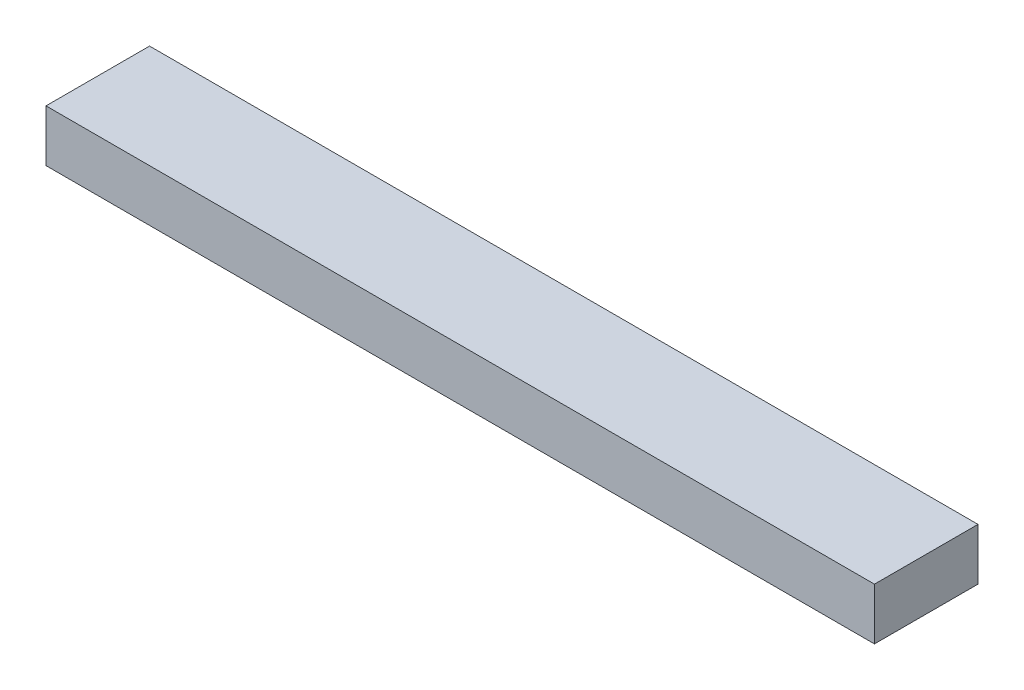
ISO-10303-21;
HEADER;
FILE_DESCRIPTION(('STEP AP214'),'2;1');
FILE_NAME('part.step','',(''),(''),'','','');
FILE_SCHEMA(('AUTOMOTIVE_DESIGN { 1 0 10303 214 1 1 1 1 }'));
ENDSEC;
DATA;
#1=APPLICATION_CONTEXT('core data for automotive mechanical design processes');
#2=APPLICATION_PROTOCOL_DEFINITION('international standard','automotive_design',2000,#1);
#3=PRODUCT_CONTEXT('',#1,'mechanical');
#4=PRODUCT('Part','Part','',(#3));
#5=PRODUCT_RELATED_PRODUCT_CATEGORY('part','',(#4));
#6=PRODUCT_DEFINITION_FORMATION('','',#4);
#7=PRODUCT_DEFINITION_CONTEXT('part definition',#1,'design');
#8=PRODUCT_DEFINITION('design','',#6,#7);
#9=PRODUCT_DEFINITION_SHAPE('','',#8);
#10=(LENGTH_UNIT() NAMED_UNIT(*) SI_UNIT(.MILLI.,.METRE.));
#11=(NAMED_UNIT(*) PLANE_ANGLE_UNIT() SI_UNIT($,.RADIAN.));
#12=(NAMED_UNIT(*) SI_UNIT($,.STERADIAN.) SOLID_ANGLE_UNIT());
#13=UNCERTAINTY_MEASURE_WITH_UNIT(LENGTH_MEASURE(1.E-05),#10,'distance_accuracy_value','');
#14=(GEOMETRIC_REPRESENTATION_CONTEXT(3) GLOBAL_UNCERTAINTY_ASSIGNED_CONTEXT((#13)) GLOBAL_UNIT_ASSIGNED_CONTEXT((#10,
#11,#12)) REPRESENTATION_CONTEXT('',''));
#15=CARTESIAN_POINT('',(0.,0.,0.));
#16=DIRECTION('',(0.,0.,1.));
#17=DIRECTION('',(1.,0.,0.));
#18=AXIS2_PLACEMENT_3D('',#15,#16,#17);
#19=CARTESIAN_POINT('',(-370.526315789474,50.,131.157894736842));
#20=DIRECTION('',(1.,0.,0.));
#21=DIRECTION('',(0.,0.,-1.));
#22=AXIS2_PLACEMENT_3D('',#19,#20,#21);
#23=PLANE('',#22);
#24=DIRECTION('',(0.,0.,1.));
#25=VECTOR('',#24,1.);
#26=CARTESIAN_POINT('',(-370.526315789474,0.,131.157894736842));
#27=LINE('',#26,#25);
#28=CARTESIAN_POINT('',(-370.526315789474,0.,31.1578947368422));
#29=VERTEX_POINT('',#28);
#30=CARTESIAN_POINT('',(-370.526315789474,0.,131.157894736842));
#31=VERTEX_POINT('',#30);
#32=EDGE_CURVE('E99',#29,#31,#27,.T.);
#33=ORIENTED_EDGE('',*,*,#32,.T.);
#34=DIRECTION('',(0.,-1.,0.));
#35=VECTOR('',#34,1.);
#36=CARTESIAN_POINT('',(-370.526315789474,50.,131.157894736842));
#37=LINE('',#36,#35);
#38=CARTESIAN_POINT('',(-370.526315789474,50.,131.157894736842));
#39=VERTEX_POINT('',#38);
#40=EDGE_CURVE('E11',#39,#31,#37,.T.);
#41=ORIENTED_EDGE('',*,*,#40,.F.);
#42=DIRECTION('',(0.,0.,1.));
#43=VECTOR('',#42,1.);
#44=CARTESIAN_POINT('',(-370.526315789474,50.,131.157894736842));
#45=LINE('',#44,#43);
#46=CARTESIAN_POINT('',(-370.526315789474,50.,31.1578947368422));
#47=VERTEX_POINT('',#46);
#48=EDGE_CURVE('E87',#47,#39,#45,.T.);
#49=ORIENTED_EDGE('',*,*,#48,.F.);
#50=DIRECTION('',(0.,-1.,0.));
#51=VECTOR('',#50,1.);
#52=CARTESIAN_POINT('',(-370.526315789474,50.,31.1578947368422));
#53=LINE('',#52,#51);
#54=EDGE_CURVE('E95',#47,#29,#53,.T.);
#55=ORIENTED_EDGE('',*,*,#54,.T.);
#56=EDGE_LOOP('',(#33,#41,#49,#55));
#57=FACE_BOUND('',#56,.T.);
#58=ADVANCED_FACE('F36',(#57),#23,.F.);
#59=CARTESIAN_POINT('',(-370.526315789474,50.,131.157894736842));
#60=DIRECTION('',(0.,0.,-1.));
#61=DIRECTION('',(-1.,0.,0.));
#62=AXIS2_PLACEMENT_3D('',#59,#60,#61);
#63=PLANE('',#62);
#64=DIRECTION('',(1.,0.,0.));
#65=VECTOR('',#64,1.);
#66=CARTESIAN_POINT('',(-370.526315789474,0.,131.157894736842));
#67=LINE('',#66,#65);
#68=CARTESIAN_POINT('',(429.473684210526,0.,131.157894736842));
#69=VERTEX_POINT('',#68);
#70=EDGE_CURVE('E91',#31,#69,#67,.T.);
#71=ORIENTED_EDGE('',*,*,#70,.T.);
#72=DIRECTION('',(0.,-1.,0.));
#73=VECTOR('',#72,1.);
#74=CARTESIAN_POINT('',(429.473684210526,50.,131.157894736842));
#75=LINE('',#74,#73);
#76=CARTESIAN_POINT('',(429.473684210526,50.,131.157894736842));
#77=VERTEX_POINT('',#76);
#78=EDGE_CURVE('E44',#77,#69,#75,.T.);
#79=ORIENTED_EDGE('',*,*,#78,.F.);
#80=DIRECTION('',(1.,0.,0.));
#81=VECTOR('',#80,1.);
#82=CARTESIAN_POINT('',(-370.526315789474,50.,131.157894736842));
#83=LINE('',#82,#81);
#84=EDGE_CURVE('E82',#39,#77,#83,.T.);
#85=ORIENTED_EDGE('',*,*,#84,.F.);
#86=ORIENTED_EDGE('',*,*,#40,.T.);
#87=EDGE_LOOP('',(#71,#79,#85,#86));
#88=FACE_BOUND('',#87,.T.);
#89=ADVANCED_FACE('F90',(#88),#63,.F.);
#90=CARTESIAN_POINT('',(429.473684210526,50.,131.157894736842));
#91=DIRECTION('',(-1.,0.,0.));
#92=DIRECTION('',(0.,0.,1.));
#93=AXIS2_PLACEMENT_3D('',#90,#91,#92);
#94=PLANE('',#93);
#95=DIRECTION('',(0.,0.,-1.));
#96=VECTOR('',#95,1.);
#97=CARTESIAN_POINT('',(429.473684210526,0.,131.157894736842));
#98=LINE('',#97,#96);
#99=CARTESIAN_POINT('',(429.473684210526,0.,31.1578947368422));
#100=VERTEX_POINT('',#99);
#101=EDGE_CURVE('E69',#69,#100,#98,.T.);
#102=ORIENTED_EDGE('',*,*,#101,.T.);
#103=DIRECTION('',(0.,-1.,0.));
#104=VECTOR('',#103,1.);
#105=CARTESIAN_POINT('',(429.473684210526,50.,31.1578947368422));
#106=LINE('',#105,#104);
#107=CARTESIAN_POINT('',(429.473684210526,50.,31.1578947368422));
#108=VERTEX_POINT('',#107);
#109=EDGE_CURVE('E92',#108,#100,#106,.T.);
#110=ORIENTED_EDGE('',*,*,#109,.F.);
#111=DIRECTION('',(0.,0.,-1.));
#112=VECTOR('',#111,1.);
#113=CARTESIAN_POINT('',(429.473684210526,50.,131.157894736842));
#114=LINE('',#113,#112);
#115=EDGE_CURVE('E85',#77,#108,#114,.T.);
#116=ORIENTED_EDGE('',*,*,#115,.F.);
#117=ORIENTED_EDGE('',*,*,#78,.T.);
#118=EDGE_LOOP('',(#102,#110,#116,#117));
#119=FACE_BOUND('',#118,.T.);
#120=ADVANCED_FACE('F93',(#119),#94,.F.);
#121=CARTESIAN_POINT('',(-370.526315789474,50.,31.1578947368422));
#122=DIRECTION('',(0.,0.,1.));
#123=DIRECTION('',(1.,0.,0.));
#124=AXIS2_PLACEMENT_3D('',#121,#122,#123);
#125=PLANE('',#124);
#126=DIRECTION('',(-1.,0.,0.));
#127=VECTOR('',#126,1.);
#128=CARTESIAN_POINT('',(-370.526315789474,0.,31.1578947368422));
#129=LINE('',#128,#127);
#130=EDGE_CURVE('E75',#100,#29,#129,.T.);
#131=ORIENTED_EDGE('',*,*,#130,.T.);
#132=ORIENTED_EDGE('',*,*,#54,.F.);
#133=DIRECTION('',(-1.,0.,0.));
#134=VECTOR('',#133,1.);
#135=CARTESIAN_POINT('',(-370.526315789474,50.,31.1578947368422));
#136=LINE('',#135,#134);
#137=EDGE_CURVE('E52',#108,#47,#136,.T.);
#138=ORIENTED_EDGE('',*,*,#137,.F.);
#139=ORIENTED_EDGE('',*,*,#109,.T.);
#140=EDGE_LOOP('',(#131,#132,#138,#139));
#141=FACE_BOUND('',#140,.T.);
#142=ADVANCED_FACE('F106',(#141),#125,.F.);
#143=CARTESIAN_POINT('',(0.,50.,0.));
#144=DIRECTION('',(0.,-1.,0.));
#145=DIRECTION('',(0.,0.,-1.));
#146=AXIS2_PLACEMENT_3D('',#143,#144,#145);
#147=PLANE('',#146);
#148=ORIENTED_EDGE('',*,*,#48,.T.);
#149=ORIENTED_EDGE('',*,*,#84,.T.);
#150=ORIENTED_EDGE('',*,*,#115,.T.);
#151=ORIENTED_EDGE('',*,*,#137,.T.);
#152=EDGE_LOOP('',(#148,#149,#150,#151));
#153=FACE_BOUND('',#152,.T.);
#154=ADVANCED_FACE('F83',(#153),#147,.F.);
#155=CARTESIAN_POINT('',(0.,0.,0.));
#156=DIRECTION('',(0.,-1.,0.));
#157=DIRECTION('',(0.,0.,-1.));
#158=AXIS2_PLACEMENT_3D('',#155,#156,#157);
#159=PLANE('',#158);
#160=ORIENTED_EDGE('',*,*,#32,.F.);
#161=ORIENTED_EDGE('',*,*,#130,.F.);
#162=ORIENTED_EDGE('',*,*,#101,.F.);
#163=ORIENTED_EDGE('',*,*,#70,.F.);
#164=EDGE_LOOP('',(#160,#161,#162,#163));
#165=FACE_BOUND('',#164,.T.);
#166=ADVANCED_FACE('F109',(#165),#159,.T.);
#167=CLOSED_SHELL('',(#58,#89,#120,#142,#154,#166));
#168=MANIFOLD_SOLID_BREP('B2',#167);
#169=ADVANCED_BREP_SHAPE_REPRESENTATION('',(#18,#168),#14);
#170=SHAPE_DEFINITION_REPRESENTATION(#9,#169);
ENDSEC;
END-ISO-10303-21;
